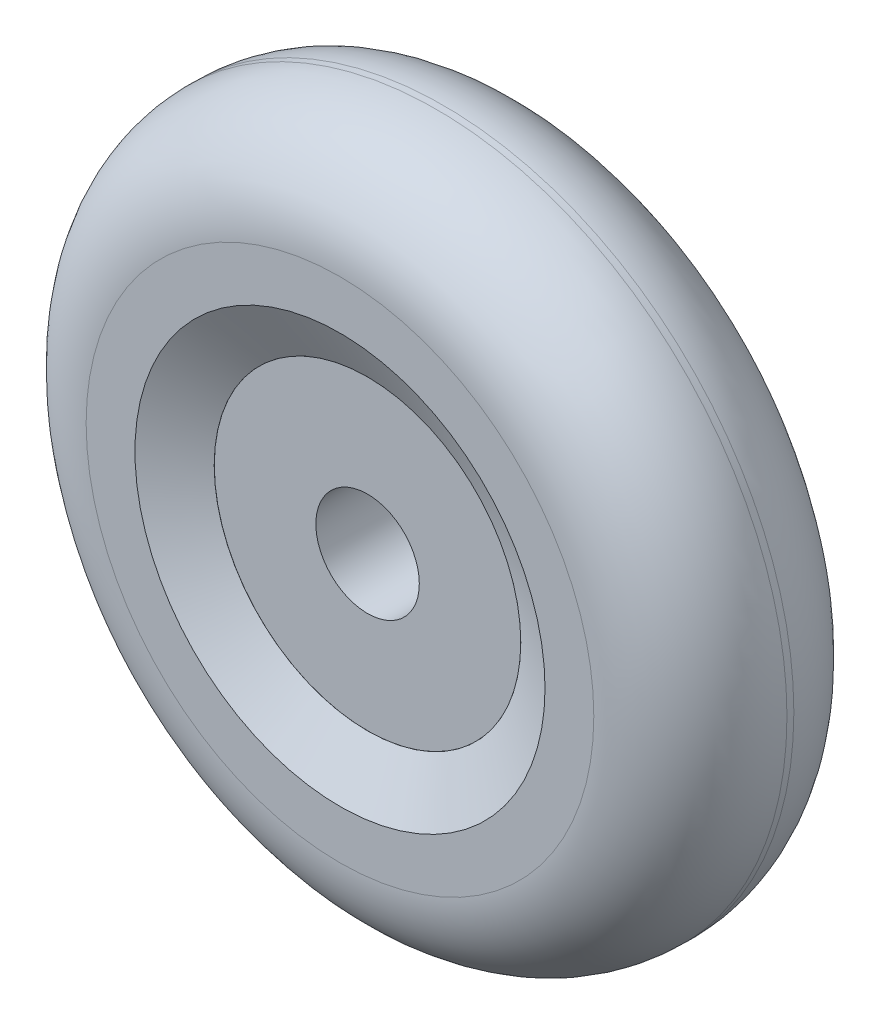
ISO-10303-21;
HEADER;
FILE_DESCRIPTION(('STEP AP214'),'2;1');
FILE_NAME('part.step','',(''),(''),'','','');
FILE_SCHEMA(('AUTOMOTIVE_DESIGN { 1 0 10303 214 1 1 1 1 }'));
ENDSEC;
DATA;
#1=APPLICATION_CONTEXT('core data for automotive mechanical design processes');
#2=APPLICATION_PROTOCOL_DEFINITION('international standard','automotive_design',2000,#1);
#3=PRODUCT_CONTEXT('',#1,'mechanical');
#4=PRODUCT('Part','Part','',(#3));
#5=PRODUCT_RELATED_PRODUCT_CATEGORY('part','',(#4));
#6=PRODUCT_DEFINITION_FORMATION('','',#4);
#7=PRODUCT_DEFINITION_CONTEXT('part definition',#1,'design');
#8=PRODUCT_DEFINITION('design','',#6,#7);
#9=PRODUCT_DEFINITION_SHAPE('','',#8);
#10=(LENGTH_UNIT() NAMED_UNIT(*) SI_UNIT(.MILLI.,.METRE.));
#11=(NAMED_UNIT(*) PLANE_ANGLE_UNIT() SI_UNIT($,.RADIAN.));
#12=(NAMED_UNIT(*) SI_UNIT($,.STERADIAN.) SOLID_ANGLE_UNIT());
#13=UNCERTAINTY_MEASURE_WITH_UNIT(LENGTH_MEASURE(1.E-05),#10,'distance_accuracy_value','');
#14=(GEOMETRIC_REPRESENTATION_CONTEXT(3) GLOBAL_UNCERTAINTY_ASSIGNED_CONTEXT((#13)) GLOBAL_UNIT_ASSIGNED_CONTEXT((#10,
#11,#12)) REPRESENTATION_CONTEXT('',''));
#15=CARTESIAN_POINT('',(0.,0.,0.));
#16=DIRECTION('',(0.,0.,1.));
#17=DIRECTION('',(1.,0.,0.));
#18=AXIS2_PLACEMENT_3D('',#15,#16,#17);
#19=CARTESIAN_POINT('',(0.,0.,29.));
#20=DIRECTION('',(0.,0.,-1.));
#21=DIRECTION('',(-1.,0.,0.));
#22=AXIS2_PLACEMENT_3D('',#19,#20,#21);
#23=CYLINDRICAL_SURFACE('',#22,101.6);
#24=CARTESIAN_POINT('',(0.,0.,-1.));
#25=DIRECTION('',(0.,0.,1.));
#26=DIRECTION('',(1.,0.,0.));
#27=AXIS2_PLACEMENT_3D('',#24,#25,#26);
#28=CIRCLE('',#27,101.6);
#29=CARTESIAN_POINT('',(-101.6,0.,-1.00000000000001));
#30=VERTEX_POINT('',#29);
#31=EDGE_CURVE('E53',#30,#30,#28,.T.);
#32=CARTESIAN_POINT('',(0.,0.,1.));
#33=DIRECTION('',(0.,0.,1.));
#34=DIRECTION('',(1.,0.,0.));
#35=AXIS2_PLACEMENT_3D('',#32,#33,#34);
#36=CIRCLE('',#35,101.6);
#37=CARTESIAN_POINT('',(-101.6,0.,1.00000000000001));
#38=VERTEX_POINT('',#37);
#39=EDGE_CURVE('E70',#38,#38,#36,.T.);
#40=CARTESIAN_POINT('',(-101.6,0.,-1.00000000000001));
#41=CARTESIAN_POINT('',(-101.6,0.,-0.979166666666674));
#42=CARTESIAN_POINT('',(-101.6,0.,-0.958333333333341));
#43=CARTESIAN_POINT('',(-101.6,0.,-0.916666666666674));
#44=CARTESIAN_POINT('',(-101.6,0.,-0.895833333333341));
#45=CARTESIAN_POINT('',(-101.6,0.,-0.854166666666674));
#46=CARTESIAN_POINT('',(-101.6,0.,-0.833333333333341));
#47=CARTESIAN_POINT('',(-101.6,0.,-0.791666666666674));
#48=CARTESIAN_POINT('',(-101.6,0.,-0.770833333333341));
#49=CARTESIAN_POINT('',(-101.6,0.,-0.729166666666673));
#50=CARTESIAN_POINT('',(-101.6,0.,-0.708333333333339));
#51=CARTESIAN_POINT('',(-101.6,0.,-0.666666666666671));
#52=CARTESIAN_POINT('',(-101.6,0.,-0.645833333333337));
#53=CARTESIAN_POINT('',(-101.6,0.,-0.604166666666671));
#54=CARTESIAN_POINT('',(-101.6,0.,-0.583333333333337));
#55=CARTESIAN_POINT('',(-101.6,0.,-0.541666666666671));
#56=CARTESIAN_POINT('',(-101.6,0.,-0.520833333333337));
#57=CARTESIAN_POINT('',(-101.6,0.,-0.479166666666671));
#58=CARTESIAN_POINT('',(-101.6,0.,-0.458333333333337));
#59=CARTESIAN_POINT('',(-101.6,0.,-0.416666666666671));
#60=CARTESIAN_POINT('',(-101.6,0.,-0.395833333333337));
#61=CARTESIAN_POINT('',(-101.6,0.,-0.35416666666667));
#62=CARTESIAN_POINT('',(-101.6,0.,-0.333333333333337));
#63=CARTESIAN_POINT('',(-101.6,0.,-0.291666666666669));
#64=CARTESIAN_POINT('',(-101.6,0.,-0.270833333333335));
#65=CARTESIAN_POINT('',(-101.6,0.,-0.229166666666667));
#66=CARTESIAN_POINT('',(-101.6,0.,-0.208333333333334));
#67=CARTESIAN_POINT('',(-101.6,0.,-0.166666666666667));
#68=CARTESIAN_POINT('',(-101.6,0.,-0.145833333333333));
#69=CARTESIAN_POINT('',(-101.6,0.,-0.104166666666667));
#70=CARTESIAN_POINT('',(-101.6,0.,-0.0833333333333334));
#71=CARTESIAN_POINT('',(-101.6,0.,-0.0416666666666667));
#72=CARTESIAN_POINT('',(-101.6,0.,-0.0208333333333334));
#73=CARTESIAN_POINT('',(-101.6,0.,0.0208333333333334));
#74=CARTESIAN_POINT('',(-101.6,0.,0.0416666666666667));
#75=CARTESIAN_POINT('',(-101.6,0.,0.0833333333333334));
#76=CARTESIAN_POINT('',(-101.6,0.,0.104166666666667));
#77=CARTESIAN_POINT('',(-101.6,0.,0.145833333333333));
#78=CARTESIAN_POINT('',(-101.6,0.,0.166666666666667));
#79=CARTESIAN_POINT('',(-101.6,0.,0.208333333333334));
#80=CARTESIAN_POINT('',(-101.6,0.,0.229166666666667));
#81=CARTESIAN_POINT('',(-101.6,0.,0.270833333333335));
#82=CARTESIAN_POINT('',(-101.6,0.,0.291666666666669));
#83=CARTESIAN_POINT('',(-101.6,0.,0.333333333333337));
#84=CARTESIAN_POINT('',(-101.6,0.,0.35416666666667));
#85=CARTESIAN_POINT('',(-101.6,0.,0.395833333333337));
#86=CARTESIAN_POINT('',(-101.6,0.,0.416666666666671));
#87=CARTESIAN_POINT('',(-101.6,0.,0.458333333333337));
#88=CARTESIAN_POINT('',(-101.6,0.,0.479166666666671));
#89=CARTESIAN_POINT('',(-101.6,0.,0.520833333333337));
#90=CARTESIAN_POINT('',(-101.6,0.,0.541666666666671));
#91=CARTESIAN_POINT('',(-101.6,0.,0.583333333333337));
#92=CARTESIAN_POINT('',(-101.6,0.,0.604166666666671));
#93=CARTESIAN_POINT('',(-101.6,0.,0.645833333333337));
#94=CARTESIAN_POINT('',(-101.6,0.,0.666666666666671));
#95=CARTESIAN_POINT('',(-101.6,0.,0.708333333333339));
#96=CARTESIAN_POINT('',(-101.6,0.,0.729166666666673));
#97=CARTESIAN_POINT('',(-101.6,0.,0.770833333333341));
#98=CARTESIAN_POINT('',(-101.6,0.,0.791666666666674));
#99=CARTESIAN_POINT('',(-101.6,0.,0.833333333333341));
#100=CARTESIAN_POINT('',(-101.6,0.,0.854166666666674));
#101=CARTESIAN_POINT('',(-101.6,0.,0.895833333333341));
#102=CARTESIAN_POINT('',(-101.6,0.,0.916666666666674));
#103=CARTESIAN_POINT('',(-101.6,0.,0.958333333333341));
#104=CARTESIAN_POINT('',(-101.6,0.,0.979166666666674));
#105=CARTESIAN_POINT('',(-101.6,0.,1.00000000000001));
#106=B_SPLINE_CURVE_WITH_KNOTS('',3,(#40,#41,#42,#43,#44,#45,#46,#47,#48,#49,#50,#51,#52,#53,
#54,#55,#56,#57,#58,#59,#60,#61,#62,#63,#64,#65,#66,#67,#68,#69,#70,#71,#72,#73,#74,#75,#76,#77,
#78,#79,#80,#81,#82,#83,#84,#85,#86,#87,#88,#89,#90,#91,#92,#93,#94,#95,#96,#97,#98,#99,#100,
#101,#102,#103,#104,#105),.UNSPECIFIED.,.F.,.F.,(4,2,2,2,2,2,2,2,2,2,2,2,2,2,2,2,2,2,2,2,2,2,2,
2,2,2,2,2,2,2,2,2,4),(0.,0.0625000000000001,0.125,0.1875,0.25,0.312500000000004,
0.375000000000004,0.437500000000004,0.500000000000004,0.562500000000004,0.625000000000004,
0.687500000000004,0.750000000000008,0.812500000000008,0.875000000000008,0.937500000000008,
1.00000000000001,1.06250000000001,1.12500000000001,1.18750000000001,1.25000000000001,
1.31250000000001,1.37500000000001,1.43750000000001,1.50000000000001,1.56250000000001,
1.62500000000001,1.68750000000001,1.75000000000002,1.81250000000002,1.87500000000002,
1.93750000000002,2.00000000000002),.UNSPECIFIED.);
#107=EDGE_CURVE('BSEAM38',#30,#38,#106,.T.);
#108=ORIENTED_EDGE('',*,*,#31,.T.);
#109=ORIENTED_EDGE('',*,*,#39,.F.);
#110=ORIENTED_EDGE('',*,*,#107,.T.);
#111=ORIENTED_EDGE('',*,*,#107,.F.);
#112=EDGE_LOOP('',(#108,#110,#109,#111));
#113=FACE_BOUND('',#112,.T.);
#114=ADVANCED_FACE('F38',(#113),#23,.T.);
#115=CARTESIAN_POINT('',(0.,0.,-29.));
#116=DIRECTION('',(0.,0.,1.));
#117=DIRECTION('',(1.,0.,0.));
#118=AXIS2_PLACEMENT_3D('',#115,#116,#117);
#119=PLANE('',#118);
#120=CARTESIAN_POINT('',(0.,0.,-29.));
#121=DIRECTION('',(0.,0.,1.));
#122=DIRECTION('',(1.,0.,0.));
#123=AXIS2_PLACEMENT_3D('',#120,#121,#122);
#124=CIRCLE('',#123,59.4500000000001);
#125=CARTESIAN_POINT('',(59.4500000000001,0.,-29.));
#126=VERTEX_POINT('',#125);
#127=EDGE_CURVE('E10',#126,#126,#124,.T.);
#128=ORIENTED_EDGE('',*,*,#127,.T.);
#129=EDGE_LOOP('',(#128));
#130=FACE_BOUND('',#129,.T.);
#131=CARTESIAN_POINT('',(0.,0.,-29.));
#132=DIRECTION('',(0.,0.,1.));
#133=DIRECTION('',(1.,0.,0.));
#134=AXIS2_PLACEMENT_3D('',#131,#132,#133);
#135=CIRCLE('',#134,73.6);
#136=CARTESIAN_POINT('',(73.6,0.,-29.));
#137=VERTEX_POINT('',#136);
#138=EDGE_CURVE('E49',#137,#137,#135,.F.);
#139=ORIENTED_EDGE('',*,*,#138,.T.);
#140=EDGE_LOOP('',(#139));
#141=FACE_BOUND('',#140,.T.);
#142=ADVANCED_FACE('F106',(#130,#141),#119,.F.);
#143=CARTESIAN_POINT('',(0.,0.,-1.));
#144=DIRECTION('',(0.,0.,1.));
#145=DIRECTION('',(1.,0.,0.));
#146=AXIS2_PLACEMENT_3D('',#143,#144,#145);
#147=TOROIDAL_SURFACE('',#146,73.6,28.);
#148=ORIENTED_EDGE('',*,*,#138,.F.);
#149=EDGE_LOOP('',(#148));
#150=FACE_BOUND('',#149,.T.);
#151=ORIENTED_EDGE('',*,*,#31,.F.);
#152=EDGE_LOOP('',(#151));
#153=FACE_BOUND('',#152,.T.);
#154=ADVANCED_FACE('F112',(#150,#153),#147,.T.);
#155=CARTESIAN_POINT('',(0.,0.,-21.));
#156=DIRECTION('',(0.,0.,-1.));
#157=DIRECTION('',(-1.,0.,0.));
#158=AXIS2_PLACEMENT_3D('',#155,#156,#157);
#159=CYLINDRICAL_SURFACE('',#158,44.45);
#160=CARTESIAN_POINT('',(0.,0.,-21.0243585250778));
#161=DIRECTION('',(0.,0.,1.));
#162=DIRECTION('',(1.,0.,0.));
#163=AXIS2_PLACEMENT_3D('',#160,#161,#162);
#164=CIRCLE('',#163,44.45);
#165=CARTESIAN_POINT('',(44.45,0.,-21.0243585250778));
#166=VERTEX_POINT('',#165);
#167=EDGE_CURVE('E45',#166,#166,#164,.F.);
#168=ORIENTED_EDGE('',*,*,#167,.T.);
#169=EDGE_LOOP('',(#168));
#170=FACE_BOUND('',#169,.T.);
#171=CARTESIAN_POINT('',(0.,0.,-21.));
#172=DIRECTION('',(0.,0.,-1.));
#173=DIRECTION('',(-1.,0.,0.));
#174=AXIS2_PLACEMENT_3D('',#171,#172,#173);
#175=CIRCLE('',#174,44.45);
#176=CARTESIAN_POINT('',(-44.45,0.,-21.));
#177=VERTEX_POINT('',#176);
#178=EDGE_CURVE('E58',#177,#177,#175,.T.);
#179=ORIENTED_EDGE('',*,*,#178,.F.);
#180=EDGE_LOOP('',(#179));
#181=FACE_BOUND('',#180,.T.);
#182=ADVANCED_FACE('F117',(#170,#181),#159,.F.);
#183=CARTESIAN_POINT('',(0.,0.,-21.));
#184=DIRECTION('',(0.,0.,-1.));
#185=DIRECTION('',(-1.,0.,0.));
#186=AXIS2_PLACEMENT_3D('',#183,#184,#185);
#187=PLANE('',#186);
#188=CARTESIAN_POINT('',(0.,0.,-21.));
#189=DIRECTION('',(0.,0.,-1.));
#190=DIRECTION('',(-1.,0.,0.));
#191=AXIS2_PLACEMENT_3D('',#188,#189,#190);
#192=CIRCLE('',#191,15.);
#193=CARTESIAN_POINT('',(-15.,0.,-21.));
#194=VERTEX_POINT('',#193);
#195=EDGE_CURVE('E76',#194,#194,#192,.T.);
#196=ORIENTED_EDGE('',*,*,#195,.F.);
#197=EDGE_LOOP('',(#196));
#198=FACE_BOUND('',#197,.T.);
#199=ORIENTED_EDGE('',*,*,#178,.T.);
#200=EDGE_LOOP('',(#199));
#201=FACE_BOUND('',#200,.T.);
#202=ADVANCED_FACE('F122',(#198,#201),#187,.T.);
#203=CARTESIAN_POINT('',(0.,0.,-21.0243585250778));
#204=DIRECTION('',(0.,0.,-1.));
#205=DIRECTION('',(-1.,0.,0.));
#206=AXIS2_PLACEMENT_3D('',#203,#204,#205);
#207=CONICAL_SURFACE('',#206,44.45,1.08210413623649);
#208=ORIENTED_EDGE('',*,*,#127,.F.);
#209=EDGE_LOOP('',(#208));
#210=FACE_BOUND('',#209,.T.);
#211=ORIENTED_EDGE('',*,*,#167,.F.);
#212=EDGE_LOOP('',(#211));
#213=FACE_BOUND('',#212,.T.);
#214=ADVANCED_FACE('F40',(#210,#213),#207,.F.);
#215=CARTESIAN_POINT('',(0.,0.,29.));
#216=DIRECTION('',(0.,0.,-1.));
#217=DIRECTION('',(1.,0.,0.));
#218=AXIS2_PLACEMENT_3D('',#215,#216,#217);
#219=PLANE('',#218);
#220=CARTESIAN_POINT('',(0.,0.,29.));
#221=DIRECTION('',(0.,0.,1.));
#222=DIRECTION('',(1.,0.,0.));
#223=AXIS2_PLACEMENT_3D('',#220,#221,#222);
#224=CIRCLE('',#223,59.4500000000001);
#225=CARTESIAN_POINT('',(59.4500000000001,0.,29.));
#226=VERTEX_POINT('',#225);
#227=EDGE_CURVE('E61',#226,#226,#224,.T.);
#228=ORIENTED_EDGE('',*,*,#227,.F.);
#229=EDGE_LOOP('',(#228));
#230=FACE_BOUND('',#229,.T.);
#231=CARTESIAN_POINT('',(0.,0.,29.));
#232=DIRECTION('',(0.,0.,1.));
#233=DIRECTION('',(1.,0.,0.));
#234=AXIS2_PLACEMENT_3D('',#231,#232,#233);
#235=CIRCLE('',#234,73.6);
#236=CARTESIAN_POINT('',(73.6,0.,29.));
#237=VERTEX_POINT('',#236);
#238=EDGE_CURVE('E67',#237,#237,#235,.F.);
#239=ORIENTED_EDGE('',*,*,#238,.F.);
#240=EDGE_LOOP('',(#239));
#241=FACE_BOUND('',#240,.T.);
#242=ADVANCED_FACE('F100',(#230,#241),#219,.F.);
#243=CARTESIAN_POINT('',(0.,0.,1.));
#244=DIRECTION('',(0.,0.,-1.));
#245=DIRECTION('',(1.,0.,0.));
#246=AXIS2_PLACEMENT_3D('',#243,#244,#245);
#247=TOROIDAL_SURFACE('',#246,73.6,28.);
#248=ORIENTED_EDGE('',*,*,#238,.T.);
#249=EDGE_LOOP('',(#248));
#250=FACE_BOUND('',#249,.T.);
#251=ORIENTED_EDGE('',*,*,#39,.T.);
#252=EDGE_LOOP('',(#251));
#253=FACE_BOUND('',#252,.T.);
#254=ADVANCED_FACE('F94',(#250,#253),#247,.T.);
#255=CARTESIAN_POINT('',(0.,0.,21.));
#256=DIRECTION('',(0.,0.,1.));
#257=DIRECTION('',(-1.,0.,0.));
#258=AXIS2_PLACEMENT_3D('',#255,#256,#257);
#259=CYLINDRICAL_SURFACE('',#258,44.45);
#260=CARTESIAN_POINT('',(0.,0.,21.0243585250778));
#261=DIRECTION('',(0.,0.,1.));
#262=DIRECTION('',(1.,0.,0.));
#263=AXIS2_PLACEMENT_3D('',#260,#261,#262);
#264=CIRCLE('',#263,44.45);
#265=CARTESIAN_POINT('',(44.45,0.,21.0243585250778));
#266=VERTEX_POINT('',#265);
#267=EDGE_CURVE('E64',#266,#266,#264,.F.);
#268=ORIENTED_EDGE('',*,*,#267,.F.);
#269=EDGE_LOOP('',(#268));
#270=FACE_BOUND('',#269,.T.);
#271=CARTESIAN_POINT('',(0.,0.,21.));
#272=DIRECTION('',(0.,0.,-1.));
#273=DIRECTION('',(-1.,0.,0.));
#274=AXIS2_PLACEMENT_3D('',#271,#272,#273);
#275=CIRCLE('',#274,44.45);
#276=CARTESIAN_POINT('',(-44.45,0.,21.));
#277=VERTEX_POINT('',#276);
#278=EDGE_CURVE('E73',#277,#277,#275,.T.);
#279=ORIENTED_EDGE('',*,*,#278,.T.);
#280=EDGE_LOOP('',(#279));
#281=FACE_BOUND('',#280,.T.);
#282=ADVANCED_FACE('F89',(#270,#281),#259,.F.);
#283=CARTESIAN_POINT('',(0.,0.,21.));
#284=DIRECTION('',(0.,0.,1.));
#285=DIRECTION('',(-1.,0.,0.));
#286=AXIS2_PLACEMENT_3D('',#283,#284,#285);
#287=PLANE('',#286);
#288=CARTESIAN_POINT('',(0.,0.,21.));
#289=DIRECTION('',(0.,0.,1.));
#290=DIRECTION('',(1.,0.,0.));
#291=AXIS2_PLACEMENT_3D('',#288,#289,#290);
#292=CIRCLE('',#291,15.);
#293=CARTESIAN_POINT('',(15.,0.,21.));
#294=VERTEX_POINT('',#293);
#295=EDGE_CURVE('E79',#294,#294,#292,.T.);
#296=ORIENTED_EDGE('',*,*,#295,.F.);
#297=EDGE_LOOP('',(#296));
#298=FACE_BOUND('',#297,.T.);
#299=ORIENTED_EDGE('',*,*,#278,.F.);
#300=EDGE_LOOP('',(#299));
#301=FACE_BOUND('',#300,.T.);
#302=ADVANCED_FACE('F85',(#298,#301),#287,.T.);
#303=CARTESIAN_POINT('',(0.,0.,21.0243585250778));
#304=DIRECTION('',(0.,0.,1.));
#305=DIRECTION('',(-1.,0.,0.));
#306=AXIS2_PLACEMENT_3D('',#303,#304,#305);
#307=CONICAL_SURFACE('',#306,44.45,1.08210413623649);
#308=ORIENTED_EDGE('',*,*,#227,.T.);
#309=EDGE_LOOP('',(#308));
#310=FACE_BOUND('',#309,.T.);
#311=ORIENTED_EDGE('',*,*,#267,.T.);
#312=EDGE_LOOP('',(#311));
#313=FACE_BOUND('',#312,.T.);
#314=ADVANCED_FACE('F88',(#310,#313),#307,.F.);
#315=CARTESIAN_POINT('',(0.,0.,-29.));
#316=DIRECTION('',(0.,0.,1.));
#317=DIRECTION('',(1.,0.,0.));
#318=AXIS2_PLACEMENT_3D('',#315,#316,#317);
#319=CYLINDRICAL_SURFACE('',#318,15.);
#320=ORIENTED_EDGE('',*,*,#195,.T.);
#321=EDGE_LOOP('',(#320));
#322=FACE_BOUND('',#321,.T.);
#323=ORIENTED_EDGE('',*,*,#295,.T.);
#324=EDGE_LOOP('',(#323));
#325=FACE_BOUND('',#324,.T.);
#326=ADVANCED_FACE('F83',(#322,#325),#319,.F.);
#327=CLOSED_SHELL('',(#114,#142,#154,#182,#202,#214,#242,#254,#282,#302,#314,#326));
#328=MANIFOLD_SOLID_BREP('B2',#327);
#329=ADVANCED_BREP_SHAPE_REPRESENTATION('',(#18,#328),#14);
#330=SHAPE_DEFINITION_REPRESENTATION(#9,#329);
ENDSEC;
END-ISO-10303-21;
